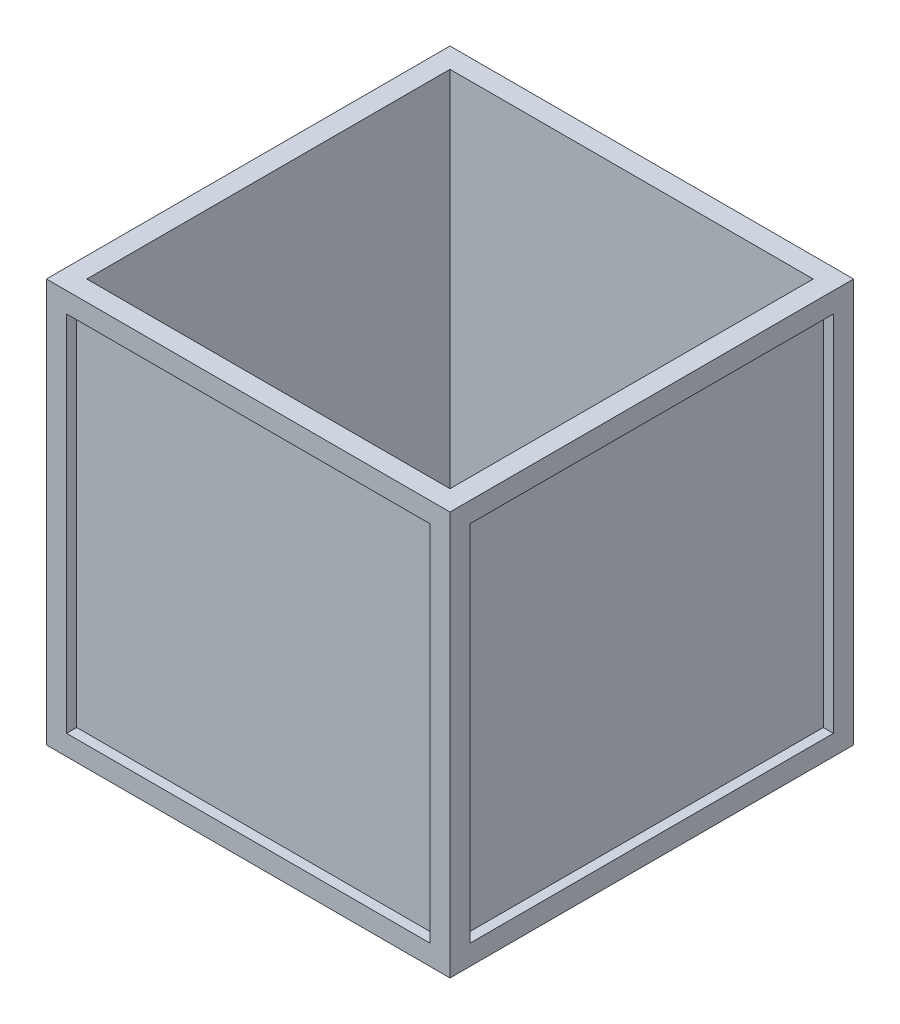
ISO-10303-21;
HEADER;
FILE_DESCRIPTION(('STEP AP214'),'2;1');
FILE_NAME('part.step','',(''),(''),'','','');
FILE_SCHEMA(('AUTOMOTIVE_DESIGN { 1 0 10303 214 1 1 1 1 }'));
ENDSEC;
DATA;
#1=APPLICATION_CONTEXT('core data for automotive mechanical design processes');
#2=APPLICATION_PROTOCOL_DEFINITION('international standard','automotive_design',2000,#1);
#3=PRODUCT_CONTEXT('',#1,'mechanical');
#4=PRODUCT('Part','Part','',(#3));
#5=PRODUCT_RELATED_PRODUCT_CATEGORY('part','',(#4));
#6=PRODUCT_DEFINITION_FORMATION('','',#4);
#7=PRODUCT_DEFINITION_CONTEXT('part definition',#1,'design');
#8=PRODUCT_DEFINITION('design','',#6,#7);
#9=PRODUCT_DEFINITION_SHAPE('','',#8);
#10=(LENGTH_UNIT() NAMED_UNIT(*) SI_UNIT(.MILLI.,.METRE.));
#11=(NAMED_UNIT(*) PLANE_ANGLE_UNIT() SI_UNIT($,.RADIAN.));
#12=(NAMED_UNIT(*) SI_UNIT($,.STERADIAN.) SOLID_ANGLE_UNIT());
#13=UNCERTAINTY_MEASURE_WITH_UNIT(LENGTH_MEASURE(1.E-05),#10,'distance_accuracy_value','');
#14=(GEOMETRIC_REPRESENTATION_CONTEXT(3) GLOBAL_UNCERTAINTY_ASSIGNED_CONTEXT((#13)) GLOBAL_UNIT_ASSIGNED_CONTEXT((#10,
#11,#12)) REPRESENTATION_CONTEXT('',''));
#15=CARTESIAN_POINT('',(0.,0.,0.));
#16=DIRECTION('',(0.,0.,1.));
#17=DIRECTION('',(1.,0.,0.));
#18=AXIS2_PLACEMENT_3D('',#15,#16,#17);
#19=CARTESIAN_POINT('',(0.,50.8,0.));
#20=DIRECTION('',(0.,-1.,0.));
#21=DIRECTION('',(0.,0.,-1.));
#22=AXIS2_PLACEMENT_3D('',#19,#20,#21);
#23=PLANE('',#22);
#24=DIRECTION('',(0.,0.,-1.));
#25=VECTOR('',#24,1.);
#26=CARTESIAN_POINT('',(25.4,50.8,25.4));
#27=LINE('',#26,#25);
#28=CARTESIAN_POINT('',(25.4,50.8,25.4));
#29=VERTEX_POINT('',#28);
#30=CARTESIAN_POINT('',(25.4,50.8,-25.4));
#31=VERTEX_POINT('',#30);
#32=EDGE_CURVE('E423',#29,#31,#27,.T.);
#33=ORIENTED_EDGE('',*,*,#32,.T.);
#34=DIRECTION('',(-1.,0.,0.));
#35=VECTOR('',#34,1.);
#36=CARTESIAN_POINT('',(-25.4,50.8,-25.4));
#37=LINE('',#36,#35);
#38=CARTESIAN_POINT('',(-25.4,50.8,-25.4));
#39=VERTEX_POINT('',#38);
#40=EDGE_CURVE('E427',#31,#39,#37,.T.);
#41=ORIENTED_EDGE('',*,*,#40,.T.);
#42=DIRECTION('',(0.,0.,1.));
#43=VECTOR('',#42,1.);
#44=CARTESIAN_POINT('',(-25.4,50.8,25.4));
#45=LINE('',#44,#43);
#46=CARTESIAN_POINT('',(-25.4,50.8,25.4));
#47=VERTEX_POINT('',#46);
#48=EDGE_CURVE('E431',#39,#47,#45,.T.);
#49=ORIENTED_EDGE('',*,*,#48,.T.);
#50=DIRECTION('',(1.,0.,0.));
#51=VECTOR('',#50,1.);
#52=CARTESIAN_POINT('',(-25.4,50.8,25.4));
#53=LINE('',#52,#51);
#54=EDGE_CURVE('E434',#47,#29,#53,.T.);
#55=ORIENTED_EDGE('',*,*,#54,.T.);
#56=EDGE_LOOP('',(#33,#41,#49,#55));
#57=FACE_BOUND('',#56,.T.);
#58=DIRECTION('',(0.,0.,-1.));
#59=VECTOR('',#58,1.);
#60=CARTESIAN_POINT('',(22.86,50.8,0.));
#61=LINE('',#60,#59);
#62=CARTESIAN_POINT('',(22.86,50.8,22.86));
#63=VERTEX_POINT('',#62);
#64=CARTESIAN_POINT('',(22.86,50.8,-22.86));
#65=VERTEX_POINT('',#64);
#66=EDGE_CURVE('E411',#63,#65,#61,.T.);
#67=ORIENTED_EDGE('',*,*,#66,.F.);
#68=DIRECTION('',(1.,0.,0.));
#69=VECTOR('',#68,1.);
#70=CARTESIAN_POINT('',(0.,50.8,22.86));
#71=LINE('',#70,#69);
#72=CARTESIAN_POINT('',(-22.86,50.8,22.86));
#73=VERTEX_POINT('',#72);
#74=EDGE_CURVE('E396',#73,#63,#71,.T.);
#75=ORIENTED_EDGE('',*,*,#74,.F.);
#76=DIRECTION('',(0.,0.,1.));
#77=VECTOR('',#76,1.);
#78=CARTESIAN_POINT('',(-22.86,50.8,0.));
#79=LINE('',#78,#77);
#80=CARTESIAN_POINT('',(-22.86,50.8,-22.86));
#81=VERTEX_POINT('',#80);
#82=EDGE_CURVE('E417',#81,#73,#79,.T.);
#83=ORIENTED_EDGE('',*,*,#82,.F.);
#84=DIRECTION('',(-1.,0.,0.));
#85=VECTOR('',#84,1.);
#86=CARTESIAN_POINT('',(0.,50.8,-22.86));
#87=LINE('',#86,#85);
#88=EDGE_CURVE('E414',#65,#81,#87,.T.);
#89=ORIENTED_EDGE('',*,*,#88,.F.);
#90=EDGE_LOOP('',(#67,#75,#83,#89));
#91=FACE_BOUND('',#90,.T.);
#92=ADVANCED_FACE('F38',(#57,#91),#23,.F.);
#93=CARTESIAN_POINT('',(25.4,50.8,25.4));
#94=DIRECTION('',(-1.,0.,0.));
#95=DIRECTION('',(0.,0.,1.));
#96=AXIS2_PLACEMENT_3D('',#93,#94,#95);
#97=PLANE('',#96);
#98=DIRECTION('',(0.,0.,1.));
#99=VECTOR('',#98,1.);
#100=CARTESIAN_POINT('',(25.4,48.26,22.86));
#101=LINE('',#100,#99);
#102=CARTESIAN_POINT('',(25.4,48.26,-22.86));
#103=VERTEX_POINT('',#102);
#104=CARTESIAN_POINT('',(25.4,48.26,22.86));
#105=VERTEX_POINT('',#104);
#106=EDGE_CURVE('E313',#103,#105,#101,.T.);
#107=ORIENTED_EDGE('',*,*,#106,.F.);
#108=DIRECTION('',(0.,1.,0.));
#109=VECTOR('',#108,1.);
#110=CARTESIAN_POINT('',(25.4,2.54,-22.86));
#111=LINE('',#110,#109);
#112=CARTESIAN_POINT('',(25.4,2.54,-22.86));
#113=VERTEX_POINT('',#112);
#114=EDGE_CURVE('E284',#113,#103,#111,.T.);
#115=ORIENTED_EDGE('',*,*,#114,.F.);
#116=DIRECTION('',(0.,0.,-1.));
#117=VECTOR('',#116,1.);
#118=CARTESIAN_POINT('',(25.4,2.54,22.86));
#119=LINE('',#118,#117);
#120=CARTESIAN_POINT('',(25.4,2.54,22.86));
#121=VERTEX_POINT('',#120);
#122=EDGE_CURVE('E298',#121,#113,#119,.T.);
#123=ORIENTED_EDGE('',*,*,#122,.F.);
#124=DIRECTION('',(0.,-1.,0.));
#125=VECTOR('',#124,1.);
#126=CARTESIAN_POINT('',(25.4,2.54,22.86));
#127=LINE('',#126,#125);
#128=EDGE_CURVE('E317',#105,#121,#127,.T.);
#129=ORIENTED_EDGE('',*,*,#128,.F.);
#130=EDGE_LOOP('',(#107,#115,#123,#129));
#131=FACE_BOUND('',#130,.T.);
#132=DIRECTION('',(0.,0.,-1.));
#133=VECTOR('',#132,1.);
#134=CARTESIAN_POINT('',(25.4,0.,25.4));
#135=LINE('',#134,#133);
#136=CARTESIAN_POINT('',(25.4,0.,25.4));
#137=VERTEX_POINT('',#136);
#138=CARTESIAN_POINT('',(25.4,0.,-25.4));
#139=VERTEX_POINT('',#138);
#140=EDGE_CURVE('E389',#137,#139,#135,.T.);
#141=ORIENTED_EDGE('',*,*,#140,.T.);
#142=DIRECTION('',(0.,-1.,0.));
#143=VECTOR('',#142,1.);
#144=CARTESIAN_POINT('',(25.4,50.8,-25.4));
#145=LINE('',#144,#143);
#146=EDGE_CURVE('E11',#31,#139,#145,.T.);
#147=ORIENTED_EDGE('',*,*,#146,.F.);
#148=ORIENTED_EDGE('',*,*,#32,.F.);
#149=DIRECTION('',(0.,-1.,0.));
#150=VECTOR('',#149,1.);
#151=CARTESIAN_POINT('',(25.4,50.8,25.4));
#152=LINE('',#151,#150);
#153=EDGE_CURVE('E437',#29,#137,#152,.T.);
#154=ORIENTED_EDGE('',*,*,#153,.T.);
#155=EDGE_LOOP('',(#141,#147,#148,#154));
#156=FACE_BOUND('',#155,.T.);
#157=ADVANCED_FACE('F40',(#131,#156),#97,.F.);
#158=CARTESIAN_POINT('',(-25.4,50.8,-25.4));
#159=DIRECTION('',(0.,0.,1.));
#160=DIRECTION('',(1.,0.,0.));
#161=AXIS2_PLACEMENT_3D('',#158,#159,#160);
#162=PLANE('',#161);
#163=DIRECTION('',(1.,0.,0.));
#164=VECTOR('',#163,1.);
#165=CARTESIAN_POINT('',(22.86,48.26,-25.4));
#166=LINE('',#165,#164);
#167=CARTESIAN_POINT('',(-22.86,48.26,-25.4));
#168=VERTEX_POINT('',#167);
#169=CARTESIAN_POINT('',(22.86,48.26,-25.4));
#170=VERTEX_POINT('',#169);
#171=EDGE_CURVE('E270',#168,#170,#166,.T.);
#172=ORIENTED_EDGE('',*,*,#171,.F.);
#173=DIRECTION('',(0.,1.,0.));
#174=VECTOR('',#173,1.);
#175=CARTESIAN_POINT('',(-22.86,2.54,-25.4));
#176=LINE('',#175,#174);
#177=CARTESIAN_POINT('',(-22.86,2.54,-25.4));
#178=VERTEX_POINT('',#177);
#179=EDGE_CURVE('E62',#178,#168,#176,.T.);
#180=ORIENTED_EDGE('',*,*,#179,.F.);
#181=DIRECTION('',(-1.,0.,0.));
#182=VECTOR('',#181,1.);
#183=CARTESIAN_POINT('',(22.86,2.54,-25.4));
#184=LINE('',#183,#182);
#185=CARTESIAN_POINT('',(22.86,2.54,-25.4));
#186=VERTEX_POINT('',#185);
#187=EDGE_CURVE('E255',#186,#178,#184,.T.);
#188=ORIENTED_EDGE('',*,*,#187,.F.);
#189=DIRECTION('',(0.,-1.,0.));
#190=VECTOR('',#189,1.);
#191=CARTESIAN_POINT('',(22.86,2.54,-25.4));
#192=LINE('',#191,#190);
#193=EDGE_CURVE('E274',#170,#186,#192,.T.);
#194=ORIENTED_EDGE('',*,*,#193,.F.);
#195=EDGE_LOOP('',(#172,#180,#188,#194));
#196=FACE_BOUND('',#195,.T.);
#197=DIRECTION('',(-1.,0.,0.));
#198=VECTOR('',#197,1.);
#199=CARTESIAN_POINT('',(-25.4,0.,-25.4));
#200=LINE('',#199,#198);
#201=CARTESIAN_POINT('',(-25.4,0.,-25.4));
#202=VERTEX_POINT('',#201);
#203=EDGE_CURVE('E441',#139,#202,#200,.T.);
#204=ORIENTED_EDGE('',*,*,#203,.T.);
#205=DIRECTION('',(0.,-1.,0.));
#206=VECTOR('',#205,1.);
#207=CARTESIAN_POINT('',(-25.4,50.8,-25.4));
#208=LINE('',#207,#206);
#209=EDGE_CURVE('E47',#39,#202,#208,.T.);
#210=ORIENTED_EDGE('',*,*,#209,.F.);
#211=ORIENTED_EDGE('',*,*,#40,.F.);
#212=ORIENTED_EDGE('',*,*,#146,.T.);
#213=EDGE_LOOP('',(#204,#210,#211,#212));
#214=FACE_BOUND('',#213,.T.);
#215=ADVANCED_FACE('F477',(#196,#214),#162,.F.);
#216=CARTESIAN_POINT('',(-25.4,50.8,25.4));
#217=DIRECTION('',(1.,0.,0.));
#218=DIRECTION('',(0.,0.,-1.));
#219=AXIS2_PLACEMENT_3D('',#216,#217,#218);
#220=PLANE('',#219);
#221=DIRECTION('',(0.,0.,-1.));
#222=VECTOR('',#221,1.);
#223=CARTESIAN_POINT('',(-25.4,48.26,-22.86));
#224=LINE('',#223,#222);
#225=CARTESIAN_POINT('',(-25.4,48.26,22.86));
#226=VERTEX_POINT('',#225);
#227=CARTESIAN_POINT('',(-25.4,48.26,-22.86));
#228=VERTEX_POINT('',#227);
#229=EDGE_CURVE('E236',#226,#228,#224,.T.);
#230=ORIENTED_EDGE('',*,*,#229,.F.);
#231=DIRECTION('',(0.,1.,0.));
#232=VECTOR('',#231,1.);
#233=CARTESIAN_POINT('',(-25.4,2.54,22.86));
#234=LINE('',#233,#232);
#235=CARTESIAN_POINT('',(-25.4,2.54,22.86));
#236=VERTEX_POINT('',#235);
#237=EDGE_CURVE('E54',#236,#226,#234,.T.);
#238=ORIENTED_EDGE('',*,*,#237,.F.);
#239=DIRECTION('',(0.,0.,1.));
#240=VECTOR('',#239,1.);
#241=CARTESIAN_POINT('',(-25.4,2.54,-22.86));
#242=LINE('',#241,#240);
#243=CARTESIAN_POINT('',(-25.4,2.54,-22.86));
#244=VERTEX_POINT('',#243);
#245=EDGE_CURVE('E223',#244,#236,#242,.T.);
#246=ORIENTED_EDGE('',*,*,#245,.F.);
#247=DIRECTION('',(0.,-1.,0.));
#248=VECTOR('',#247,1.);
#249=CARTESIAN_POINT('',(-25.4,2.54,-22.86));
#250=LINE('',#249,#248);
#251=EDGE_CURVE('E227',#228,#244,#250,.T.);
#252=ORIENTED_EDGE('',*,*,#251,.F.);
#253=EDGE_LOOP('',(#230,#238,#246,#252));
#254=FACE_BOUND('',#253,.T.);
#255=DIRECTION('',(0.,0.,1.));
#256=VECTOR('',#255,1.);
#257=CARTESIAN_POINT('',(-25.4,0.,25.4));
#258=LINE('',#257,#256);
#259=CARTESIAN_POINT('',(-25.4,0.,25.4));
#260=VERTEX_POINT('',#259);
#261=EDGE_CURVE('E444',#202,#260,#258,.T.);
#262=ORIENTED_EDGE('',*,*,#261,.T.);
#263=DIRECTION('',(0.,-1.,0.));
#264=VECTOR('',#263,1.);
#265=CARTESIAN_POINT('',(-25.4,50.8,25.4));
#266=LINE('',#265,#264);
#267=EDGE_CURVE('E452',#47,#260,#266,.T.);
#268=ORIENTED_EDGE('',*,*,#267,.F.);
#269=ORIENTED_EDGE('',*,*,#48,.F.);
#270=ORIENTED_EDGE('',*,*,#209,.T.);
#271=EDGE_LOOP('',(#262,#268,#269,#270));
#272=FACE_BOUND('',#271,.T.);
#273=ADVANCED_FACE('F461',(#254,#272),#220,.F.);
#274=CARTESIAN_POINT('',(-25.4,50.8,25.4));
#275=DIRECTION('',(0.,0.,-1.));
#276=DIRECTION('',(-1.,0.,0.));
#277=AXIS2_PLACEMENT_3D('',#274,#275,#276);
#278=PLANE('',#277);
#279=DIRECTION('',(-1.,0.,0.));
#280=VECTOR('',#279,1.);
#281=CARTESIAN_POINT('',(-22.86,48.26,25.4));
#282=LINE('',#281,#280);
#283=CARTESIAN_POINT('',(22.86,48.26,25.4));
#284=VERTEX_POINT('',#283);
#285=CARTESIAN_POINT('',(-22.86,48.26,25.4));
#286=VERTEX_POINT('',#285);
#287=EDGE_CURVE('E357',#284,#286,#282,.T.);
#288=ORIENTED_EDGE('',*,*,#287,.F.);
#289=DIRECTION('',(0.,1.,0.));
#290=VECTOR('',#289,1.);
#291=CARTESIAN_POINT('',(22.86,2.54,25.4));
#292=LINE('',#291,#290);
#293=CARTESIAN_POINT('',(22.86,2.54,25.4));
#294=VERTEX_POINT('',#293);
#295=EDGE_CURVE('E327',#294,#284,#292,.T.);
#296=ORIENTED_EDGE('',*,*,#295,.F.);
#297=DIRECTION('',(1.,0.,0.));
#298=VECTOR('',#297,1.);
#299=CARTESIAN_POINT('',(-22.86,2.54,25.4));
#300=LINE('',#299,#298);
#301=CARTESIAN_POINT('',(-22.86,2.54,25.4));
#302=VERTEX_POINT('',#301);
#303=EDGE_CURVE('E342',#302,#294,#300,.T.);
#304=ORIENTED_EDGE('',*,*,#303,.F.);
#305=DIRECTION('',(0.,-1.,0.));
#306=VECTOR('',#305,1.);
#307=CARTESIAN_POINT('',(-22.86,2.54,25.4));
#308=LINE('',#307,#306);
#309=EDGE_CURVE('E361',#286,#302,#308,.T.);
#310=ORIENTED_EDGE('',*,*,#309,.F.);
#311=EDGE_LOOP('',(#288,#296,#304,#310));
#312=FACE_BOUND('',#311,.T.);
#313=DIRECTION('',(1.,0.,0.));
#314=VECTOR('',#313,1.);
#315=CARTESIAN_POINT('',(-25.4,0.,25.4));
#316=LINE('',#315,#314);
#317=EDGE_CURVE('E428',#260,#137,#316,.T.);
#318=ORIENTED_EDGE('',*,*,#317,.T.);
#319=ORIENTED_EDGE('',*,*,#153,.F.);
#320=ORIENTED_EDGE('',*,*,#54,.F.);
#321=ORIENTED_EDGE('',*,*,#267,.T.);
#322=EDGE_LOOP('',(#318,#319,#320,#321));
#323=FACE_BOUND('',#322,.T.);
#324=ADVANCED_FACE('F470',(#312,#323),#278,.F.);
#325=CARTESIAN_POINT('',(0.,0.,0.));
#326=DIRECTION('',(0.,-1.,0.));
#327=DIRECTION('',(0.,0.,-1.));
#328=AXIS2_PLACEMENT_3D('',#325,#326,#327);
#329=PLANE('',#328);
#330=ORIENTED_EDGE('',*,*,#140,.F.);
#331=ORIENTED_EDGE('',*,*,#317,.F.);
#332=ORIENTED_EDGE('',*,*,#261,.F.);
#333=ORIENTED_EDGE('',*,*,#203,.F.);
#334=EDGE_LOOP('',(#330,#331,#332,#333));
#335=FACE_BOUND('',#334,.T.);
#336=ADVANCED_FACE('F467',(#335),#329,.T.);
#337=CARTESIAN_POINT('',(22.86,50.8,25.4));
#338=DIRECTION('',(-1.,0.,0.));
#339=DIRECTION('',(0.,0.,1.));
#340=AXIS2_PLACEMENT_3D('',#337,#338,#339);
#341=PLANE('',#340);
#342=DIRECTION('',(0.,0.,-1.));
#343=VECTOR('',#342,1.);
#344=CARTESIAN_POINT('',(22.86,2.54,0.));
#345=LINE('',#344,#343);
#346=CARTESIAN_POINT('',(22.86,2.54,22.86));
#347=VERTEX_POINT('',#346);
#348=CARTESIAN_POINT('',(22.86,2.54,-22.86));
#349=VERTEX_POINT('',#348);
#350=EDGE_CURVE('E371',#347,#349,#345,.T.);
#351=ORIENTED_EDGE('',*,*,#350,.F.);
#352=DIRECTION('',(0.,-1.,0.));
#353=VECTOR('',#352,1.);
#354=CARTESIAN_POINT('',(22.86,50.8,22.86));
#355=LINE('',#354,#353);
#356=EDGE_CURVE('E391',#63,#347,#355,.T.);
#357=ORIENTED_EDGE('',*,*,#356,.F.);
#358=ORIENTED_EDGE('',*,*,#66,.T.);
#359=DIRECTION('',(0.,-1.,0.));
#360=VECTOR('',#359,1.);
#361=CARTESIAN_POINT('',(22.86,50.8,-22.86));
#362=LINE('',#361,#360);
#363=EDGE_CURVE('E385',#65,#349,#362,.T.);
#364=ORIENTED_EDGE('',*,*,#363,.T.);
#365=EDGE_LOOP('',(#351,#357,#358,#364));
#366=FACE_BOUND('',#365,.T.);
#367=ADVANCED_FACE('F501',(#366),#341,.T.);
#368=CARTESIAN_POINT('',(-25.4,50.8,-22.86));
#369=DIRECTION('',(0.,0.,1.));
#370=DIRECTION('',(1.,0.,0.));
#371=AXIS2_PLACEMENT_3D('',#368,#369,#370);
#372=PLANE('',#371);
#373=DIRECTION('',(-1.,0.,0.));
#374=VECTOR('',#373,1.);
#375=CARTESIAN_POINT('',(0.,2.54,-22.86));
#376=LINE('',#375,#374);
#377=CARTESIAN_POINT('',(-22.86,2.54,-22.86));
#378=VERTEX_POINT('',#377);
#379=EDGE_CURVE('E384',#349,#378,#376,.T.);
#380=ORIENTED_EDGE('',*,*,#379,.F.);
#381=ORIENTED_EDGE('',*,*,#363,.F.);
#382=ORIENTED_EDGE('',*,*,#88,.T.);
#383=DIRECTION('',(0.,-1.,0.));
#384=VECTOR('',#383,1.);
#385=CARTESIAN_POINT('',(-22.86,50.8,-22.86));
#386=LINE('',#385,#384);
#387=EDGE_CURVE('E390',#81,#378,#386,.T.);
#388=ORIENTED_EDGE('',*,*,#387,.T.);
#389=EDGE_LOOP('',(#380,#381,#382,#388));
#390=FACE_BOUND('',#389,.T.);
#391=ADVANCED_FACE('F547',(#390),#372,.T.);
#392=CARTESIAN_POINT('',(-22.86,50.8,25.4));
#393=DIRECTION('',(1.,0.,0.));
#394=DIRECTION('',(0.,0.,-1.));
#395=AXIS2_PLACEMENT_3D('',#392,#393,#394);
#396=PLANE('',#395);
#397=DIRECTION('',(0.,0.,1.));
#398=VECTOR('',#397,1.);
#399=CARTESIAN_POINT('',(-22.86,2.54,0.));
#400=LINE('',#399,#398);
#401=CARTESIAN_POINT('',(-22.86,2.54,22.86));
#402=VERTEX_POINT('',#401);
#403=EDGE_CURVE('E399',#378,#402,#400,.T.);
#404=ORIENTED_EDGE('',*,*,#403,.F.);
#405=ORIENTED_EDGE('',*,*,#387,.F.);
#406=ORIENTED_EDGE('',*,*,#82,.T.);
#407=DIRECTION('',(0.,-1.,0.));
#408=VECTOR('',#407,1.);
#409=CARTESIAN_POINT('',(-22.86,50.8,22.86));
#410=LINE('',#409,#408);
#411=EDGE_CURVE('E395',#73,#402,#410,.T.);
#412=ORIENTED_EDGE('',*,*,#411,.T.);
#413=EDGE_LOOP('',(#404,#405,#406,#412));
#414=FACE_BOUND('',#413,.T.);
#415=ADVANCED_FACE('F551',(#414),#396,.T.);
#416=CARTESIAN_POINT('',(-25.4,50.8,22.86));
#417=DIRECTION('',(0.,0.,-1.));
#418=DIRECTION('',(-1.,0.,0.));
#419=AXIS2_PLACEMENT_3D('',#416,#417,#418);
#420=PLANE('',#419);
#421=DIRECTION('',(1.,0.,0.));
#422=VECTOR('',#421,1.);
#423=CARTESIAN_POINT('',(0.,2.54,22.86));
#424=LINE('',#423,#422);
#425=EDGE_CURVE('E405',#402,#347,#424,.T.);
#426=ORIENTED_EDGE('',*,*,#425,.F.);
#427=ORIENTED_EDGE('',*,*,#411,.F.);
#428=ORIENTED_EDGE('',*,*,#74,.T.);
#429=ORIENTED_EDGE('',*,*,#356,.T.);
#430=EDGE_LOOP('',(#426,#427,#428,#429));
#431=FACE_BOUND('',#430,.T.);
#432=ADVANCED_FACE('F554',(#431),#420,.T.);
#433=CARTESIAN_POINT('',(0.,2.54,0.));
#434=DIRECTION('',(0.,-1.,0.));
#435=DIRECTION('',(0.,0.,-1.));
#436=AXIS2_PLACEMENT_3D('',#433,#434,#435);
#437=PLANE('',#436);
#438=ORIENTED_EDGE('',*,*,#350,.T.);
#439=ORIENTED_EDGE('',*,*,#379,.T.);
#440=ORIENTED_EDGE('',*,*,#403,.T.);
#441=ORIENTED_EDGE('',*,*,#425,.T.);
#442=EDGE_LOOP('',(#438,#439,#440,#441));
#443=FACE_BOUND('',#442,.T.);
#444=ADVANCED_FACE('F497',(#443),#437,.F.);
#445=CARTESIAN_POINT('',(22.86,2.54,24.13));
#446=DIRECTION('',(1.,0.,0.));
#447=DIRECTION('',(0.,0.,-1.));
#448=AXIS2_PLACEMENT_3D('',#445,#446,#447);
#449=PLANE('',#448);
#450=ORIENTED_EDGE('',*,*,#295,.T.);
#451=DIRECTION('',(0.,0.,1.));
#452=VECTOR('',#451,1.);
#453=CARTESIAN_POINT('',(22.86,48.26,24.13));
#454=LINE('',#453,#452);
#455=CARTESIAN_POINT('',(22.86,48.26,24.13));
#456=VERTEX_POINT('',#455);
#457=EDGE_CURVE('E354',#456,#284,#454,.T.);
#458=ORIENTED_EDGE('',*,*,#457,.F.);
#459=DIRECTION('',(0.,1.,0.));
#460=VECTOR('',#459,1.);
#461=CARTESIAN_POINT('',(22.86,2.54,24.13));
#462=LINE('',#461,#460);
#463=CARTESIAN_POINT('',(22.86,2.54,24.13));
#464=VERTEX_POINT('',#463);
#465=EDGE_CURVE('E337',#464,#456,#462,.T.);
#466=ORIENTED_EDGE('',*,*,#465,.F.);
#467=DIRECTION('',(0.,0.,1.));
#468=VECTOR('',#467,1.);
#469=CARTESIAN_POINT('',(22.86,2.54,24.13));
#470=LINE('',#469,#468);
#471=EDGE_CURVE('E368',#464,#294,#470,.T.);
#472=ORIENTED_EDGE('',*,*,#471,.T.);
#473=EDGE_LOOP('',(#450,#458,#466,#472));
#474=FACE_BOUND('',#473,.T.);
#475=ADVANCED_FACE('F518',(#474),#449,.F.);
#476=CARTESIAN_POINT('',(-22.86,2.54,24.13));
#477=DIRECTION('',(0.,-1.,0.));
#478=DIRECTION('',(0.,0.,-1.));
#479=AXIS2_PLACEMENT_3D('',#476,#477,#478);
#480=PLANE('',#479);
#481=ORIENTED_EDGE('',*,*,#303,.T.);
#482=ORIENTED_EDGE('',*,*,#471,.F.);
#483=DIRECTION('',(1.,0.,0.));
#484=VECTOR('',#483,1.);
#485=CARTESIAN_POINT('',(-22.86,2.54,24.13));
#486=LINE('',#485,#484);
#487=CARTESIAN_POINT('',(-22.86,2.54,24.13));
#488=VERTEX_POINT('',#487);
#489=EDGE_CURVE('E350',#488,#464,#486,.T.);
#490=ORIENTED_EDGE('',*,*,#489,.F.);
#491=DIRECTION('',(0.,0.,1.));
#492=VECTOR('',#491,1.);
#493=CARTESIAN_POINT('',(-22.86,2.54,24.13));
#494=LINE('',#493,#492);
#495=EDGE_CURVE('E372',#488,#302,#494,.T.);
#496=ORIENTED_EDGE('',*,*,#495,.T.);
#497=EDGE_LOOP('',(#481,#482,#490,#496));
#498=FACE_BOUND('',#497,.T.);
#499=ADVANCED_FACE('F521',(#498),#480,.F.);
#500=CARTESIAN_POINT('',(-22.86,2.54,24.13));
#501=DIRECTION('',(-1.,0.,0.));
#502=DIRECTION('',(0.,0.,1.));
#503=AXIS2_PLACEMENT_3D('',#500,#501,#502);
#504=PLANE('',#503);
#505=ORIENTED_EDGE('',*,*,#309,.T.);
#506=ORIENTED_EDGE('',*,*,#495,.F.);
#507=DIRECTION('',(0.,-1.,0.));
#508=VECTOR('',#507,1.);
#509=CARTESIAN_POINT('',(-22.86,2.54,24.13));
#510=LINE('',#509,#508);
#511=CARTESIAN_POINT('',(-22.86,48.26,24.13));
#512=VERTEX_POINT('',#511);
#513=EDGE_CURVE('E346',#512,#488,#510,.T.);
#514=ORIENTED_EDGE('',*,*,#513,.F.);
#515=DIRECTION('',(0.,0.,1.));
#516=VECTOR('',#515,1.);
#517=CARTESIAN_POINT('',(-22.86,48.26,24.13));
#518=LINE('',#517,#516);
#519=EDGE_CURVE('E375',#512,#286,#518,.T.);
#520=ORIENTED_EDGE('',*,*,#519,.T.);
#521=EDGE_LOOP('',(#505,#506,#514,#520));
#522=FACE_BOUND('',#521,.T.);
#523=ADVANCED_FACE('F523',(#522),#504,.F.);
#524=CARTESIAN_POINT('',(-22.86,48.26,24.13));
#525=DIRECTION('',(0.,1.,0.));
#526=DIRECTION('',(0.,0.,1.));
#527=AXIS2_PLACEMENT_3D('',#524,#525,#526);
#528=PLANE('',#527);
#529=ORIENTED_EDGE('',*,*,#287,.T.);
#530=ORIENTED_EDGE('',*,*,#519,.F.);
#531=DIRECTION('',(-1.,0.,0.));
#532=VECTOR('',#531,1.);
#533=CARTESIAN_POINT('',(-22.86,48.26,24.13));
#534=LINE('',#533,#532);
#535=EDGE_CURVE('E341',#456,#512,#534,.T.);
#536=ORIENTED_EDGE('',*,*,#535,.F.);
#537=ORIENTED_EDGE('',*,*,#457,.T.);
#538=EDGE_LOOP('',(#529,#530,#536,#537));
#539=FACE_BOUND('',#538,.T.);
#540=ADVANCED_FACE('F513',(#539),#528,.F.);
#541=CARTESIAN_POINT('',(0.,0.,24.13));
#542=DIRECTION('',(0.,0.,-1.));
#543=DIRECTION('',(-1.,0.,0.));
#544=AXIS2_PLACEMENT_3D('',#541,#542,#543);
#545=PLANE('',#544);
#546=ORIENTED_EDGE('',*,*,#465,.T.);
#547=ORIENTED_EDGE('',*,*,#535,.T.);
#548=ORIENTED_EDGE('',*,*,#513,.T.);
#549=ORIENTED_EDGE('',*,*,#489,.T.);
#550=EDGE_LOOP('',(#546,#547,#548,#549));
#551=FACE_BOUND('',#550,.T.);
#552=ADVANCED_FACE('F525',(#551),#545,.F.);
#553=CARTESIAN_POINT('',(24.13,2.54,-22.86));
#554=DIRECTION('',(0.,0.,-1.));
#555=DIRECTION('',(-1.,0.,0.));
#556=AXIS2_PLACEMENT_3D('',#553,#554,#555);
#557=PLANE('',#556);
#558=ORIENTED_EDGE('',*,*,#114,.T.);
#559=DIRECTION('',(1.,0.,0.));
#560=VECTOR('',#559,1.);
#561=CARTESIAN_POINT('',(24.13,48.26,-22.86));
#562=LINE('',#561,#560);
#563=CARTESIAN_POINT('',(24.13,48.26,-22.86));
#564=VERTEX_POINT('',#563);
#565=EDGE_CURVE('E310',#564,#103,#562,.T.);
#566=ORIENTED_EDGE('',*,*,#565,.F.);
#567=DIRECTION('',(0.,1.,0.));
#568=VECTOR('',#567,1.);
#569=CARTESIAN_POINT('',(24.13,2.54,-22.86));
#570=LINE('',#569,#568);
#571=CARTESIAN_POINT('',(24.13,2.54,-22.86));
#572=VERTEX_POINT('',#571);
#573=EDGE_CURVE('E293',#572,#564,#570,.T.);
#574=ORIENTED_EDGE('',*,*,#573,.F.);
#575=DIRECTION('',(1.,0.,0.));
#576=VECTOR('',#575,1.);
#577=CARTESIAN_POINT('',(24.13,2.54,-22.86));
#578=LINE('',#577,#576);
#579=EDGE_CURVE('E324',#572,#113,#578,.T.);
#580=ORIENTED_EDGE('',*,*,#579,.T.);
#581=EDGE_LOOP('',(#558,#566,#574,#580));
#582=FACE_BOUND('',#581,.T.);
#583=ADVANCED_FACE('F527',(#582),#557,.F.);
#584=CARTESIAN_POINT('',(24.13,2.54,22.86));
#585=DIRECTION('',(0.,-1.,0.));
#586=DIRECTION('',(0.,0.,-1.));
#587=AXIS2_PLACEMENT_3D('',#584,#585,#586);
#588=PLANE('',#587);
#589=ORIENTED_EDGE('',*,*,#122,.T.);
#590=ORIENTED_EDGE('',*,*,#579,.F.);
#591=DIRECTION('',(0.,0.,-1.));
#592=VECTOR('',#591,1.);
#593=CARTESIAN_POINT('',(24.13,2.54,22.86));
#594=LINE('',#593,#592);
#595=CARTESIAN_POINT('',(24.13,2.54,22.86));
#596=VERTEX_POINT('',#595);
#597=EDGE_CURVE('E306',#596,#572,#594,.T.);
#598=ORIENTED_EDGE('',*,*,#597,.F.);
#599=DIRECTION('',(1.,0.,0.));
#600=VECTOR('',#599,1.);
#601=CARTESIAN_POINT('',(24.13,2.54,22.86));
#602=LINE('',#601,#600);
#603=EDGE_CURVE('E328',#596,#121,#602,.T.);
#604=ORIENTED_EDGE('',*,*,#603,.T.);
#605=EDGE_LOOP('',(#589,#590,#598,#604));
#606=FACE_BOUND('',#605,.T.);
#607=ADVANCED_FACE('F533',(#606),#588,.F.);
#608=CARTESIAN_POINT('',(24.13,2.54,22.86));
#609=DIRECTION('',(0.,0.,1.));
#610=DIRECTION('',(1.,0.,0.));
#611=AXIS2_PLACEMENT_3D('',#608,#609,#610);
#612=PLANE('',#611);
#613=ORIENTED_EDGE('',*,*,#128,.T.);
#614=ORIENTED_EDGE('',*,*,#603,.F.);
#615=DIRECTION('',(0.,-1.,0.));
#616=VECTOR('',#615,1.);
#617=CARTESIAN_POINT('',(24.13,2.54,22.86));
#618=LINE('',#617,#616);
#619=CARTESIAN_POINT('',(24.13,48.26,22.86));
#620=VERTEX_POINT('',#619);
#621=EDGE_CURVE('E302',#620,#596,#618,.T.);
#622=ORIENTED_EDGE('',*,*,#621,.F.);
#623=DIRECTION('',(1.,0.,0.));
#624=VECTOR('',#623,1.);
#625=CARTESIAN_POINT('',(24.13,48.26,22.86));
#626=LINE('',#625,#624);
#627=EDGE_CURVE('E331',#620,#105,#626,.T.);
#628=ORIENTED_EDGE('',*,*,#627,.T.);
#629=EDGE_LOOP('',(#613,#614,#622,#628));
#630=FACE_BOUND('',#629,.T.);
#631=ADVANCED_FACE('F610',(#630),#612,.F.);
#632=CARTESIAN_POINT('',(24.13,48.26,22.86));
#633=DIRECTION('',(0.,1.,0.));
#634=DIRECTION('',(0.,0.,1.));
#635=AXIS2_PLACEMENT_3D('',#632,#633,#634);
#636=PLANE('',#635);
#637=ORIENTED_EDGE('',*,*,#106,.T.);
#638=ORIENTED_EDGE('',*,*,#627,.F.);
#639=DIRECTION('',(0.,0.,1.));
#640=VECTOR('',#639,1.);
#641=CARTESIAN_POINT('',(24.13,48.26,22.86));
#642=LINE('',#641,#640);
#643=EDGE_CURVE('E297',#564,#620,#642,.T.);
#644=ORIENTED_EDGE('',*,*,#643,.F.);
#645=ORIENTED_EDGE('',*,*,#565,.T.);
#646=EDGE_LOOP('',(#637,#638,#644,#645));
#647=FACE_BOUND('',#646,.T.);
#648=ADVANCED_FACE('F620',(#647),#636,.F.);
#649=CARTESIAN_POINT('',(24.13,0.,0.));
#650=DIRECTION('',(-1.,0.,0.));
#651=DIRECTION('',(0.,0.,1.));
#652=AXIS2_PLACEMENT_3D('',#649,#650,#651);
#653=PLANE('',#652);
#654=ORIENTED_EDGE('',*,*,#573,.T.);
#655=ORIENTED_EDGE('',*,*,#643,.T.);
#656=ORIENTED_EDGE('',*,*,#621,.T.);
#657=ORIENTED_EDGE('',*,*,#597,.T.);
#658=EDGE_LOOP('',(#654,#655,#656,#657));
#659=FACE_BOUND('',#658,.T.);
#660=ADVANCED_FACE('F629',(#659),#653,.F.);
#661=CARTESIAN_POINT('',(-22.86,2.54,-24.13));
#662=DIRECTION('',(-1.,0.,0.));
#663=DIRECTION('',(0.,0.,1.));
#664=AXIS2_PLACEMENT_3D('',#661,#662,#663);
#665=PLANE('',#664);
#666=ORIENTED_EDGE('',*,*,#179,.T.);
#667=DIRECTION('',(0.,0.,-1.));
#668=VECTOR('',#667,1.);
#669=CARTESIAN_POINT('',(-22.86,48.26,-24.13));
#670=LINE('',#669,#668);
#671=CARTESIAN_POINT('',(-22.86,48.26,-24.13));
#672=VERTEX_POINT('',#671);
#673=EDGE_CURVE('E267',#672,#168,#670,.T.);
#674=ORIENTED_EDGE('',*,*,#673,.F.);
#675=DIRECTION('',(0.,1.,0.));
#676=VECTOR('',#675,1.);
#677=CARTESIAN_POINT('',(-22.86,2.54,-24.13));
#678=LINE('',#677,#676);
#679=CARTESIAN_POINT('',(-22.86,2.54,-24.13));
#680=VERTEX_POINT('',#679);
#681=EDGE_CURVE('E250',#680,#672,#678,.T.);
#682=ORIENTED_EDGE('',*,*,#681,.F.);
#683=DIRECTION('',(0.,0.,-1.));
#684=VECTOR('',#683,1.);
#685=CARTESIAN_POINT('',(-22.86,2.54,-24.13));
#686=LINE('',#685,#684);
#687=EDGE_CURVE('E281',#680,#178,#686,.T.);
#688=ORIENTED_EDGE('',*,*,#687,.T.);
#689=EDGE_LOOP('',(#666,#674,#682,#688));
#690=FACE_BOUND('',#689,.T.);
#691=ADVANCED_FACE('F637',(#690),#665,.F.);
#692=CARTESIAN_POINT('',(22.86,2.54,-24.13));
#693=DIRECTION('',(0.,-1.,0.));
#694=DIRECTION('',(0.,0.,-1.));
#695=AXIS2_PLACEMENT_3D('',#692,#693,#694);
#696=PLANE('',#695);
#697=ORIENTED_EDGE('',*,*,#187,.T.);
#698=ORIENTED_EDGE('',*,*,#687,.F.);
#699=DIRECTION('',(-1.,0.,0.));
#700=VECTOR('',#699,1.);
#701=CARTESIAN_POINT('',(22.86,2.54,-24.13));
#702=LINE('',#701,#700);
#703=CARTESIAN_POINT('',(22.86,2.54,-24.13));
#704=VERTEX_POINT('',#703);
#705=EDGE_CURVE('E263',#704,#680,#702,.T.);
#706=ORIENTED_EDGE('',*,*,#705,.F.);
#707=DIRECTION('',(0.,0.,-1.));
#708=VECTOR('',#707,1.);
#709=CARTESIAN_POINT('',(22.86,2.54,-24.13));
#710=LINE('',#709,#708);
#711=EDGE_CURVE('E285',#704,#186,#710,.T.);
#712=ORIENTED_EDGE('',*,*,#711,.T.);
#713=EDGE_LOOP('',(#697,#698,#706,#712));
#714=FACE_BOUND('',#713,.T.);
#715=ADVANCED_FACE('F647',(#714),#696,.F.);
#716=CARTESIAN_POINT('',(22.86,2.54,-24.13));
#717=DIRECTION('',(1.,0.,0.));
#718=DIRECTION('',(0.,0.,-1.));
#719=AXIS2_PLACEMENT_3D('',#716,#717,#718);
#720=PLANE('',#719);
#721=ORIENTED_EDGE('',*,*,#193,.T.);
#722=ORIENTED_EDGE('',*,*,#711,.F.);
#723=DIRECTION('',(0.,-1.,0.));
#724=VECTOR('',#723,1.);
#725=CARTESIAN_POINT('',(22.86,2.54,-24.13));
#726=LINE('',#725,#724);
#727=CARTESIAN_POINT('',(22.86,48.26,-24.13));
#728=VERTEX_POINT('',#727);
#729=EDGE_CURVE('E259',#728,#704,#726,.T.);
#730=ORIENTED_EDGE('',*,*,#729,.F.);
#731=DIRECTION('',(0.,0.,-1.));
#732=VECTOR('',#731,1.);
#733=CARTESIAN_POINT('',(22.86,48.26,-24.13));
#734=LINE('',#733,#732);
#735=EDGE_CURVE('E288',#728,#170,#734,.T.);
#736=ORIENTED_EDGE('',*,*,#735,.T.);
#737=EDGE_LOOP('',(#721,#722,#730,#736));
#738=FACE_BOUND('',#737,.T.);
#739=ADVANCED_FACE('F653',(#738),#720,.F.);
#740=CARTESIAN_POINT('',(22.86,48.26,-24.13));
#741=DIRECTION('',(0.,1.,0.));
#742=DIRECTION('',(0.,0.,1.));
#743=AXIS2_PLACEMENT_3D('',#740,#741,#742);
#744=PLANE('',#743);
#745=ORIENTED_EDGE('',*,*,#171,.T.);
#746=ORIENTED_EDGE('',*,*,#735,.F.);
#747=DIRECTION('',(1.,0.,0.));
#748=VECTOR('',#747,1.);
#749=CARTESIAN_POINT('',(22.86,48.26,-24.13));
#750=LINE('',#749,#748);
#751=EDGE_CURVE('E254',#672,#728,#750,.T.);
#752=ORIENTED_EDGE('',*,*,#751,.F.);
#753=ORIENTED_EDGE('',*,*,#673,.T.);
#754=EDGE_LOOP('',(#745,#746,#752,#753));
#755=FACE_BOUND('',#754,.T.);
#756=ADVANCED_FACE('F661',(#755),#744,.F.);
#757=CARTESIAN_POINT('',(0.,0.,-24.13));
#758=DIRECTION('',(0.,0.,1.));
#759=DIRECTION('',(1.,0.,0.));
#760=AXIS2_PLACEMENT_3D('',#757,#758,#759);
#761=PLANE('',#760);
#762=ORIENTED_EDGE('',*,*,#681,.T.);
#763=ORIENTED_EDGE('',*,*,#751,.T.);
#764=ORIENTED_EDGE('',*,*,#729,.T.);
#765=ORIENTED_EDGE('',*,*,#705,.T.);
#766=EDGE_LOOP('',(#762,#763,#764,#765));
#767=FACE_BOUND('',#766,.T.);
#768=ADVANCED_FACE('F669',(#767),#761,.F.);
#769=CARTESIAN_POINT('',(-24.13,2.54,22.86));
#770=DIRECTION('',(0.,0.,1.));
#771=DIRECTION('',(1.,0.,0.));
#772=AXIS2_PLACEMENT_3D('',#769,#770,#771);
#773=PLANE('',#772);
#774=ORIENTED_EDGE('',*,*,#237,.T.);
#775=DIRECTION('',(-1.,0.,0.));
#776=VECTOR('',#775,1.);
#777=CARTESIAN_POINT('',(-24.13,48.26,22.86));
#778=LINE('',#777,#776);
#779=CARTESIAN_POINT('',(-24.13,48.26,22.86));
#780=VERTEX_POINT('',#779);
#781=EDGE_CURVE('E198',#780,#226,#778,.T.);
#782=ORIENTED_EDGE('',*,*,#781,.F.);
#783=DIRECTION('',(0.,1.,0.));
#784=VECTOR('',#783,1.);
#785=CARTESIAN_POINT('',(-24.13,2.54,22.86));
#786=LINE('',#785,#784);
#787=CARTESIAN_POINT('',(-24.13,2.54,22.86));
#788=VERTEX_POINT('',#787);
#789=EDGE_CURVE('E202',#788,#780,#786,.T.);
#790=ORIENTED_EDGE('',*,*,#789,.F.);
#791=DIRECTION('',(-1.,0.,0.));
#792=VECTOR('',#791,1.);
#793=CARTESIAN_POINT('',(-24.13,2.54,22.86));
#794=LINE('',#793,#792);
#795=EDGE_CURVE('E242',#788,#236,#794,.T.);
#796=ORIENTED_EDGE('',*,*,#795,.T.);
#797=EDGE_LOOP('',(#774,#782,#790,#796));
#798=FACE_BOUND('',#797,.T.);
#799=ADVANCED_FACE('F200',(#798),#773,.F.);
#800=CARTESIAN_POINT('',(-24.13,2.54,-22.86));
#801=DIRECTION('',(0.,-1.,0.));
#802=DIRECTION('',(0.,0.,-1.));
#803=AXIS2_PLACEMENT_3D('',#800,#801,#802);
#804=PLANE('',#803);
#805=ORIENTED_EDGE('',*,*,#245,.T.);
#806=ORIENTED_EDGE('',*,*,#795,.F.);
#807=DIRECTION('',(0.,0.,1.));
#808=VECTOR('',#807,1.);
#809=CARTESIAN_POINT('',(-24.13,2.54,-22.86));
#810=LINE('',#809,#808);
#811=CARTESIAN_POINT('',(-24.13,2.54,-22.86));
#812=VERTEX_POINT('',#811);
#813=EDGE_CURVE('E209',#812,#788,#810,.T.);
#814=ORIENTED_EDGE('',*,*,#813,.F.);
#815=DIRECTION('',(-1.,0.,0.));
#816=VECTOR('',#815,1.);
#817=CARTESIAN_POINT('',(-24.13,2.54,-22.86));
#818=LINE('',#817,#816);
#819=EDGE_CURVE('E245',#812,#244,#818,.T.);
#820=ORIENTED_EDGE('',*,*,#819,.T.);
#821=EDGE_LOOP('',(#805,#806,#814,#820));
#822=FACE_BOUND('',#821,.T.);
#823=ADVANCED_FACE('F684',(#822),#804,.F.);
#824=CARTESIAN_POINT('',(-24.13,2.54,-22.86));
#825=DIRECTION('',(0.,0.,-1.));
#826=DIRECTION('',(-1.,0.,0.));
#827=AXIS2_PLACEMENT_3D('',#824,#825,#826);
#828=PLANE('',#827);
#829=ORIENTED_EDGE('',*,*,#251,.T.);
#830=ORIENTED_EDGE('',*,*,#819,.F.);
#831=DIRECTION('',(0.,-1.,0.));
#832=VECTOR('',#831,1.);
#833=CARTESIAN_POINT('',(-24.13,2.54,-22.86));
#834=LINE('',#833,#832);
#835=CARTESIAN_POINT('',(-24.13,48.26,-22.86));
#836=VERTEX_POINT('',#835);
#837=EDGE_CURVE('E218',#836,#812,#834,.T.);
#838=ORIENTED_EDGE('',*,*,#837,.F.);
#839=DIRECTION('',(-1.,0.,0.));
#840=VECTOR('',#839,1.);
#841=CARTESIAN_POINT('',(-24.13,48.26,-22.86));
#842=LINE('',#841,#840);
#843=EDGE_CURVE('E208',#836,#228,#842,.T.);
#844=ORIENTED_EDGE('',*,*,#843,.T.);
#845=EDGE_LOOP('',(#829,#830,#838,#844));
#846=FACE_BOUND('',#845,.T.);
#847=ADVANCED_FACE('F691',(#846),#828,.F.);
#848=CARTESIAN_POINT('',(-24.13,48.26,-22.86));
#849=DIRECTION('',(0.,1.,0.));
#850=DIRECTION('',(0.,0.,1.));
#851=AXIS2_PLACEMENT_3D('',#848,#849,#850);
#852=PLANE('',#851);
#853=ORIENTED_EDGE('',*,*,#229,.T.);
#854=ORIENTED_EDGE('',*,*,#843,.F.);
#855=DIRECTION('',(0.,0.,-1.));
#856=VECTOR('',#855,1.);
#857=CARTESIAN_POINT('',(-24.13,48.26,-22.86));
#858=LINE('',#857,#856);
#859=EDGE_CURVE('E212',#780,#836,#858,.T.);
#860=ORIENTED_EDGE('',*,*,#859,.F.);
#861=ORIENTED_EDGE('',*,*,#781,.T.);
#862=EDGE_LOOP('',(#853,#854,#860,#861));
#863=FACE_BOUND('',#862,.T.);
#864=ADVANCED_FACE('F213',(#863),#852,.F.);
#865=CARTESIAN_POINT('',(-24.13,0.,0.));
#866=DIRECTION('',(1.,0.,0.));
#867=DIRECTION('',(0.,0.,-1.));
#868=AXIS2_PLACEMENT_3D('',#865,#866,#867);
#869=PLANE('',#868);
#870=ORIENTED_EDGE('',*,*,#789,.T.);
#871=ORIENTED_EDGE('',*,*,#859,.T.);
#872=ORIENTED_EDGE('',*,*,#837,.T.);
#873=ORIENTED_EDGE('',*,*,#813,.T.);
#874=EDGE_LOOP('',(#870,#871,#872,#873));
#875=FACE_BOUND('',#874,.T.);
#876=ADVANCED_FACE('F220',(#875),#869,.F.);
#877=CLOSED_SHELL('',(#92,#157,#215,#273,#324,#336,#367,#391,#415,#432,#444,#475,#499,#523,#540,
#552,#583,#607,#631,#648,#660,#691,#715,#739,#756,#768,#799,#823,#847,#864,#876));
#878=MANIFOLD_SOLID_BREP('B2',#877);
#879=ADVANCED_BREP_SHAPE_REPRESENTATION('',(#18,#878),#14);
#880=SHAPE_DEFINITION_REPRESENTATION(#9,#879);
ENDSEC;
END-ISO-10303-21;
